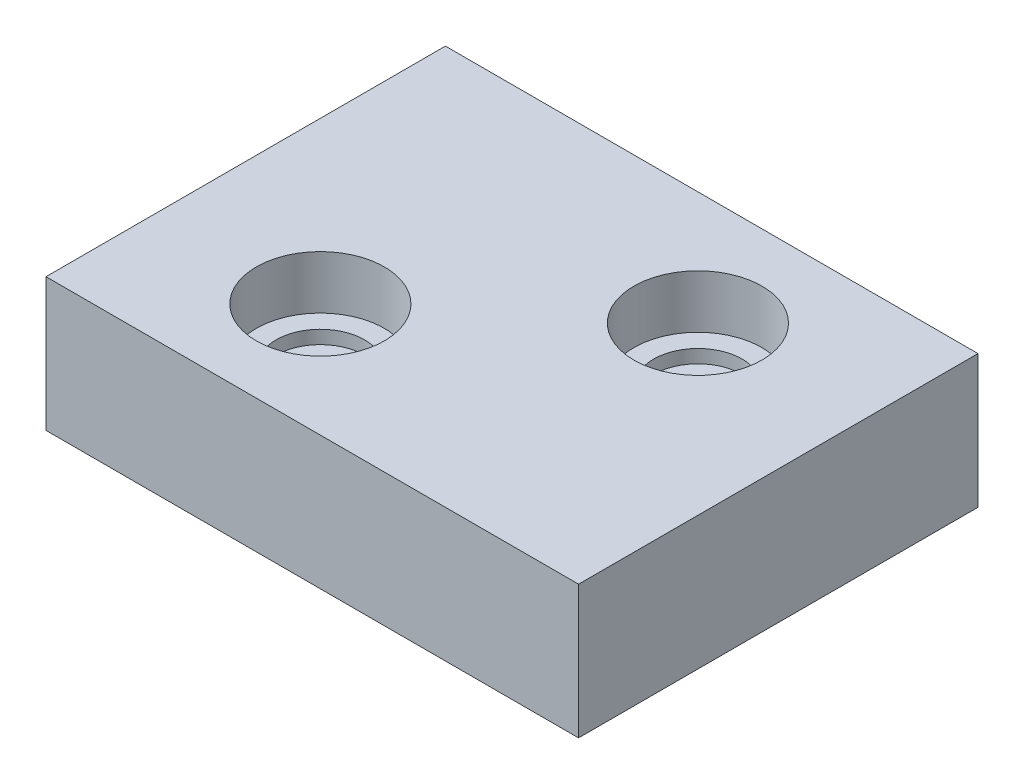
ISO-10303-21;
HEADER;
FILE_DESCRIPTION(('STEP AP214'),'2;1');
FILE_NAME('part.step','',(''),(''),'','','');
FILE_SCHEMA(('AUTOMOTIVE_DESIGN { 1 0 10303 214 1 1 1 1 }'));
ENDSEC;
DATA;
#1=APPLICATION_CONTEXT('core data for automotive mechanical design processes');
#2=APPLICATION_PROTOCOL_DEFINITION('international standard','automotive_design',2000,#1);
#3=PRODUCT_CONTEXT('',#1,'mechanical');
#4=PRODUCT('Part','Part','',(#3));
#5=PRODUCT_RELATED_PRODUCT_CATEGORY('part','',(#4));
#6=PRODUCT_DEFINITION_FORMATION('','',#4);
#7=PRODUCT_DEFINITION_CONTEXT('part definition',#1,'design');
#8=PRODUCT_DEFINITION('design','',#6,#7);
#9=PRODUCT_DEFINITION_SHAPE('','',#8);
#10=(LENGTH_UNIT() NAMED_UNIT(*) SI_UNIT(.MILLI.,.METRE.));
#11=(NAMED_UNIT(*) PLANE_ANGLE_UNIT() SI_UNIT($,.RADIAN.));
#12=(NAMED_UNIT(*) SI_UNIT($,.STERADIAN.) SOLID_ANGLE_UNIT());
#13=UNCERTAINTY_MEASURE_WITH_UNIT(LENGTH_MEASURE(1.E-05),#10,'distance_accuracy_value','');
#14=(GEOMETRIC_REPRESENTATION_CONTEXT(3) GLOBAL_UNCERTAINTY_ASSIGNED_CONTEXT((#13)) GLOBAL_UNIT_ASSIGNED_CONTEXT((#10,
#11,#12)) REPRESENTATION_CONTEXT('',''));
#15=CARTESIAN_POINT('',(0.,0.,0.));
#16=DIRECTION('',(0.,0.,1.));
#17=DIRECTION('',(1.,0.,0.));
#18=AXIS2_PLACEMENT_3D('',#15,#16,#17);
#19=CARTESIAN_POINT('',(20.,10.,15.));
#20=DIRECTION('',(-1.,0.,0.));
#21=DIRECTION('',(0.,0.,1.));
#22=AXIS2_PLACEMENT_3D('',#19,#20,#21);
#23=PLANE('',#22);
#24=DIRECTION('',(0.,0.,-1.));
#25=VECTOR('',#24,1.);
#26=CARTESIAN_POINT('',(20.,0.,15.));
#27=LINE('',#26,#25);
#28=CARTESIAN_POINT('',(20.,0.,15.));
#29=VERTEX_POINT('',#28);
#30=CARTESIAN_POINT('',(20.,0.,-15.));
#31=VERTEX_POINT('',#30);
#32=EDGE_CURVE('E111',#29,#31,#27,.T.);
#33=ORIENTED_EDGE('',*,*,#32,.T.);
#34=DIRECTION('',(0.,-1.,0.));
#35=VECTOR('',#34,1.);
#36=CARTESIAN_POINT('',(20.,10.,-15.));
#37=LINE('',#36,#35);
#38=CARTESIAN_POINT('',(20.,10.,-15.));
#39=VERTEX_POINT('',#38);
#40=EDGE_CURVE('E11',#39,#31,#37,.T.);
#41=ORIENTED_EDGE('',*,*,#40,.F.);
#42=DIRECTION('',(0.,0.,-1.));
#43=VECTOR('',#42,1.);
#44=CARTESIAN_POINT('',(20.,10.,15.));
#45=LINE('',#44,#43);
#46=CARTESIAN_POINT('',(20.,10.,15.));
#47=VERTEX_POINT('',#46);
#48=EDGE_CURVE('E95',#47,#39,#45,.T.);
#49=ORIENTED_EDGE('',*,*,#48,.F.);
#50=DIRECTION('',(0.,-1.,0.));
#51=VECTOR('',#50,1.);
#52=CARTESIAN_POINT('',(20.,10.,15.));
#53=LINE('',#52,#51);
#54=EDGE_CURVE('E107',#47,#29,#53,.T.);
#55=ORIENTED_EDGE('',*,*,#54,.T.);
#56=EDGE_LOOP('',(#33,#41,#49,#55));
#57=FACE_BOUND('',#56,.T.);
#58=ADVANCED_FACE('F43',(#57),#23,.F.);
#59=CARTESIAN_POINT('',(-20.,10.,-15.));
#60=DIRECTION('',(0.,0.,1.));
#61=DIRECTION('',(1.,0.,0.));
#62=AXIS2_PLACEMENT_3D('',#59,#60,#61);
#63=PLANE('',#62);
#64=DIRECTION('',(-1.,0.,0.));
#65=VECTOR('',#64,1.);
#66=CARTESIAN_POINT('',(-20.,0.,-15.));
#67=LINE('',#66,#65);
#68=CARTESIAN_POINT('',(-20.,0.,-15.));
#69=VERTEX_POINT('',#68);
#70=EDGE_CURVE('E100',#31,#69,#67,.T.);
#71=ORIENTED_EDGE('',*,*,#70,.T.);
#72=DIRECTION('',(0.,-1.,0.));
#73=VECTOR('',#72,1.);
#74=CARTESIAN_POINT('',(-20.,10.,-15.));
#75=LINE('',#74,#73);
#76=CARTESIAN_POINT('',(-20.,10.,-15.));
#77=VERTEX_POINT('',#76);
#78=EDGE_CURVE('E52',#77,#69,#75,.T.);
#79=ORIENTED_EDGE('',*,*,#78,.F.);
#80=DIRECTION('',(-1.,0.,0.));
#81=VECTOR('',#80,1.);
#82=CARTESIAN_POINT('',(-20.,10.,-15.));
#83=LINE('',#82,#81);
#84=EDGE_CURVE('E90',#39,#77,#83,.T.);
#85=ORIENTED_EDGE('',*,*,#84,.F.);
#86=ORIENTED_EDGE('',*,*,#40,.T.);
#87=EDGE_LOOP('',(#71,#79,#85,#86));
#88=FACE_BOUND('',#87,.T.);
#89=ADVANCED_FACE('F99',(#88),#63,.F.);
#90=CARTESIAN_POINT('',(-20.,10.,15.));
#91=DIRECTION('',(1.,0.,0.));
#92=DIRECTION('',(0.,0.,-1.));
#93=AXIS2_PLACEMENT_3D('',#90,#91,#92);
#94=PLANE('',#93);
#95=DIRECTION('',(0.,0.,1.));
#96=VECTOR('',#95,1.);
#97=CARTESIAN_POINT('',(-20.,0.,15.));
#98=LINE('',#97,#96);
#99=CARTESIAN_POINT('',(-20.,0.,15.));
#100=VERTEX_POINT('',#99);
#101=EDGE_CURVE('E77',#69,#100,#98,.T.);
#102=ORIENTED_EDGE('',*,*,#101,.T.);
#103=DIRECTION('',(0.,-1.,0.));
#104=VECTOR('',#103,1.);
#105=CARTESIAN_POINT('',(-20.,10.,15.));
#106=LINE('',#105,#104);
#107=CARTESIAN_POINT('',(-20.,10.,15.));
#108=VERTEX_POINT('',#107);
#109=EDGE_CURVE('E102',#108,#100,#106,.T.);
#110=ORIENTED_EDGE('',*,*,#109,.F.);
#111=DIRECTION('',(0.,0.,1.));
#112=VECTOR('',#111,1.);
#113=CARTESIAN_POINT('',(-20.,10.,15.));
#114=LINE('',#113,#112);
#115=EDGE_CURVE('E93',#77,#108,#114,.T.);
#116=ORIENTED_EDGE('',*,*,#115,.F.);
#117=ORIENTED_EDGE('',*,*,#78,.T.);
#118=EDGE_LOOP('',(#102,#110,#116,#117));
#119=FACE_BOUND('',#118,.T.);
#120=ADVANCED_FACE('F103',(#119),#94,.F.);
#121=CARTESIAN_POINT('',(-20.,10.,15.));
#122=DIRECTION('',(0.,0.,-1.));
#123=DIRECTION('',(-1.,0.,0.));
#124=AXIS2_PLACEMENT_3D('',#121,#122,#123);
#125=PLANE('',#124);
#126=DIRECTION('',(1.,0.,0.));
#127=VECTOR('',#126,1.);
#128=CARTESIAN_POINT('',(-20.,0.,15.));
#129=LINE('',#128,#127);
#130=EDGE_CURVE('E83',#100,#29,#129,.T.);
#131=ORIENTED_EDGE('',*,*,#130,.T.);
#132=ORIENTED_EDGE('',*,*,#54,.F.);
#133=DIRECTION('',(1.,0.,0.));
#134=VECTOR('',#133,1.);
#135=CARTESIAN_POINT('',(-20.,10.,15.));
#136=LINE('',#135,#134);
#137=EDGE_CURVE('E60',#108,#47,#136,.T.);
#138=ORIENTED_EDGE('',*,*,#137,.F.);
#139=ORIENTED_EDGE('',*,*,#109,.T.);
#140=EDGE_LOOP('',(#131,#132,#138,#139));
#141=FACE_BOUND('',#140,.T.);
#142=ADVANCED_FACE('F125',(#141),#125,.F.);
#143=CARTESIAN_POINT('',(0.,10.,0.));
#144=DIRECTION('',(0.,-1.,0.));
#145=DIRECTION('',(0.,0.,-1.));
#146=AXIS2_PLACEMENT_3D('',#143,#144,#145);
#147=PLANE('',#146);
#148=CARTESIAN_POINT('',(-7.9286,10.,6.465));
#149=DIRECTION('',(0.,1.,0.));
#150=DIRECTION('',(0.,0.,1.));
#151=AXIS2_PLACEMENT_3D('',#148,#149,#150);
#152=CIRCLE('',#151,4.8125);
#153=CARTESIAN_POINT('',(-7.9286,10.,11.2775));
#154=VERTEX_POINT('',#153);
#155=EDGE_CURVE('E173',#154,#154,#152,.T.);
#156=ORIENTED_EDGE('',*,*,#155,.F.);
#157=EDGE_LOOP('',(#156));
#158=FACE_BOUND('',#157,.T.);
#159=CARTESIAN_POINT('',(7.5,10.,-6.4636));
#160=DIRECTION('',(0.,1.,0.));
#161=DIRECTION('',(0.,0.,1.));
#162=AXIS2_PLACEMENT_3D('',#159,#160,#161);
#163=CIRCLE('',#162,4.8125);
#164=CARTESIAN_POINT('',(7.5,10.,-1.6511));
#165=VERTEX_POINT('',#164);
#166=EDGE_CURVE('E168',#165,#165,#163,.T.);
#167=ORIENTED_EDGE('',*,*,#166,.F.);
#168=EDGE_LOOP('',(#167));
#169=FACE_BOUND('',#168,.T.);
#170=ORIENTED_EDGE('',*,*,#48,.T.);
#171=ORIENTED_EDGE('',*,*,#84,.T.);
#172=ORIENTED_EDGE('',*,*,#115,.T.);
#173=ORIENTED_EDGE('',*,*,#137,.T.);
#174=EDGE_LOOP('',(#170,#171,#172,#173));
#175=FACE_BOUND('',#174,.T.);
#176=ADVANCED_FACE('F91',(#158,#169,#175),#147,.F.);
#177=CARTESIAN_POINT('',(0.,0.,0.));
#178=DIRECTION('',(0.,-1.,0.));
#179=DIRECTION('',(0.,0.,-1.));
#180=AXIS2_PLACEMENT_3D('',#177,#178,#179);
#181=PLANE('',#180);
#182=CARTESIAN_POINT('',(-13.3333333333333,0.,10.));
#183=DIRECTION('',(0.,-1.,0.));
#184=DIRECTION('',(0.,0.,1.));
#185=AXIS2_PLACEMENT_3D('',#182,#183,#184);
#186=CIRCLE('',#185,1.55);
#187=CARTESIAN_POINT('',(-13.3333333333333,0.,11.55));
#188=VERTEX_POINT('',#187);
#189=EDGE_CURVE('E136',#188,#188,#186,.T.);
#190=ORIENTED_EDGE('',*,*,#189,.F.);
#191=EDGE_LOOP('',(#190));
#192=FACE_BOUND('',#191,.T.);
#193=CARTESIAN_POINT('',(13.3333333333333,0.,-10.));
#194=DIRECTION('',(0.,-1.,0.));
#195=DIRECTION('',(0.,0.,1.));
#196=AXIS2_PLACEMENT_3D('',#193,#194,#195);
#197=CIRCLE('',#196,1.55);
#198=CARTESIAN_POINT('',(13.3333333333333,0.,-8.45));
#199=VERTEX_POINT('',#198);
#200=EDGE_CURVE('E144',#199,#199,#197,.T.);
#201=ORIENTED_EDGE('',*,*,#200,.F.);
#202=EDGE_LOOP('',(#201));
#203=FACE_BOUND('',#202,.T.);
#204=CARTESIAN_POINT('',(-13.3333333333333,0.,-9.99999999999999));
#205=DIRECTION('',(0.,-1.,0.));
#206=DIRECTION('',(0.,0.,-1.));
#207=AXIS2_PLACEMENT_3D('',#204,#205,#206);
#208=CIRCLE('',#207,1.55);
#209=CARTESIAN_POINT('',(-13.3333333333333,0.,-11.55));
#210=VERTEX_POINT('',#209);
#211=EDGE_CURVE('E145',#210,#210,#208,.T.);
#212=ORIENTED_EDGE('',*,*,#211,.F.);
#213=EDGE_LOOP('',(#212));
#214=FACE_BOUND('',#213,.T.);
#215=CARTESIAN_POINT('',(13.3333333333333,0.,10.));
#216=DIRECTION('',(0.,-1.,0.));
#217=DIRECTION('',(0.,0.,-1.));
#218=AXIS2_PLACEMENT_3D('',#215,#216,#217);
#219=CIRCLE('',#218,1.55);
#220=CARTESIAN_POINT('',(13.3333333333333,0.,8.45));
#221=VERTEX_POINT('',#220);
#222=EDGE_CURVE('E132',#221,#221,#219,.T.);
#223=ORIENTED_EDGE('',*,*,#222,.F.);
#224=EDGE_LOOP('',(#223));
#225=FACE_BOUND('',#224,.T.);
#226=ORIENTED_EDGE('',*,*,#32,.F.);
#227=ORIENTED_EDGE('',*,*,#130,.F.);
#228=ORIENTED_EDGE('',*,*,#101,.F.);
#229=ORIENTED_EDGE('',*,*,#70,.F.);
#230=EDGE_LOOP('',(#226,#227,#228,#229));
#231=FACE_BOUND('',#230,.T.);
#232=ADVANCED_FACE('F128',(#192,#203,#214,#225,#231),#181,.T.);
#233=CARTESIAN_POINT('',(13.3333333333333,4.,10.));
#234=DIRECTION('',(0.,-1.,0.));
#235=DIRECTION('',(0.,0.,-1.));
#236=AXIS2_PLACEMENT_3D('',#233,#234,#235);
#237=CYLINDRICAL_SURFACE('',#236,1.55);
#238=CARTESIAN_POINT('',(13.3333333333333,4.,10.));
#239=DIRECTION('',(0.,-1.,0.));
#240=DIRECTION('',(0.,0.,-1.));
#241=AXIS2_PLACEMENT_3D('',#238,#239,#240);
#242=CIRCLE('',#241,1.55);
#243=CARTESIAN_POINT('',(13.3333333333333,4.,8.45));
#244=VERTEX_POINT('',#243);
#245=EDGE_CURVE('E115',#244,#244,#242,.T.);
#246=ORIENTED_EDGE('',*,*,#245,.F.);
#247=EDGE_LOOP('',(#246));
#248=FACE_BOUND('',#247,.T.);
#249=ORIENTED_EDGE('',*,*,#222,.T.);
#250=EDGE_LOOP('',(#249));
#251=FACE_BOUND('',#250,.T.);
#252=ADVANCED_FACE('F249',(#248,#251),#237,.F.);
#253=CARTESIAN_POINT('',(13.3333333333333,4.,10.));
#254=DIRECTION('',(0.,-1.,0.));
#255=DIRECTION('',(0.,0.,-1.));
#256=AXIS2_PLACEMENT_3D('',#253,#254,#255);
#257=PLANE('',#256);
#258=ORIENTED_EDGE('',*,*,#245,.T.);
#259=EDGE_LOOP('',(#258));
#260=FACE_BOUND('',#259,.T.);
#261=ADVANCED_FACE('F254',(#260),#257,.T.);
#262=CARTESIAN_POINT('',(-13.3333333333333,4.,-9.99999999999999));
#263=DIRECTION('',(0.,-1.,0.));
#264=DIRECTION('',(0.,0.,-1.));
#265=AXIS2_PLACEMENT_3D('',#262,#263,#264);
#266=CYLINDRICAL_SURFACE('',#265,1.55);
#267=CARTESIAN_POINT('',(-13.3333333333333,4.,-9.99999999999999));
#268=DIRECTION('',(0.,-1.,0.));
#269=DIRECTION('',(0.,0.,-1.));
#270=AXIS2_PLACEMENT_3D('',#267,#268,#269);
#271=CIRCLE('',#270,1.55);
#272=CARTESIAN_POINT('',(-13.3333333333333,4.,-11.55));
#273=VERTEX_POINT('',#272);
#274=EDGE_CURVE('E156',#273,#273,#271,.T.);
#275=ORIENTED_EDGE('',*,*,#274,.F.);
#276=EDGE_LOOP('',(#275));
#277=FACE_BOUND('',#276,.T.);
#278=ORIENTED_EDGE('',*,*,#211,.T.);
#279=EDGE_LOOP('',(#278));
#280=FACE_BOUND('',#279,.T.);
#281=ADVANCED_FACE('F258',(#277,#280),#266,.F.);
#282=CARTESIAN_POINT('',(-13.3333333333333,4.,-9.99999999999999));
#283=DIRECTION('',(0.,-1.,0.));
#284=DIRECTION('',(0.,0.,-1.));
#285=AXIS2_PLACEMENT_3D('',#282,#283,#284);
#286=PLANE('',#285);
#287=ORIENTED_EDGE('',*,*,#274,.T.);
#288=EDGE_LOOP('',(#287));
#289=FACE_BOUND('',#288,.T.);
#290=ADVANCED_FACE('F266',(#289),#286,.T.);
#291=CARTESIAN_POINT('',(13.3333333333333,4.,-10.));
#292=DIRECTION('',(0.,-1.,0.));
#293=DIRECTION('',(0.,0.,-1.));
#294=AXIS2_PLACEMENT_3D('',#291,#292,#293);
#295=CYLINDRICAL_SURFACE('',#294,1.55);
#296=CARTESIAN_POINT('',(13.3333333333333,4.,-10.));
#297=DIRECTION('',(0.,-1.,0.));
#298=DIRECTION('',(0.,0.,1.));
#299=AXIS2_PLACEMENT_3D('',#296,#297,#298);
#300=CIRCLE('',#299,1.55);
#301=CARTESIAN_POINT('',(13.3333333333333,4.,-8.45));
#302=VERTEX_POINT('',#301);
#303=EDGE_CURVE('E140',#302,#302,#300,.T.);
#304=ORIENTED_EDGE('',*,*,#303,.F.);
#305=EDGE_LOOP('',(#304));
#306=FACE_BOUND('',#305,.T.);
#307=ORIENTED_EDGE('',*,*,#200,.T.);
#308=EDGE_LOOP('',(#307));
#309=FACE_BOUND('',#308,.T.);
#310=ADVANCED_FACE('F263',(#306,#309),#295,.F.);
#311=CARTESIAN_POINT('',(13.3333333333333,4.,-10.));
#312=DIRECTION('',(0.,1.,0.));
#313=DIRECTION('',(0.,0.,1.));
#314=AXIS2_PLACEMENT_3D('',#311,#312,#313);
#315=PLANE('',#314);
#316=ORIENTED_EDGE('',*,*,#303,.T.);
#317=EDGE_LOOP('',(#316));
#318=FACE_BOUND('',#317,.T.);
#319=ADVANCED_FACE('F260',(#318),#315,.F.);
#320=CARTESIAN_POINT('',(-13.3333333333333,4.,10.));
#321=DIRECTION('',(0.,-1.,0.));
#322=DIRECTION('',(0.,0.,-1.));
#323=AXIS2_PLACEMENT_3D('',#320,#321,#322);
#324=CYLINDRICAL_SURFACE('',#323,1.55);
#325=CARTESIAN_POINT('',(-13.3333333333333,4.,10.));
#326=DIRECTION('',(0.,-1.,0.));
#327=DIRECTION('',(0.,0.,1.));
#328=AXIS2_PLACEMENT_3D('',#325,#326,#327);
#329=CIRCLE('',#328,1.55);
#330=CARTESIAN_POINT('',(-13.3333333333333,4.,11.55));
#331=VERTEX_POINT('',#330);
#332=EDGE_CURVE('E149',#331,#331,#329,.T.);
#333=ORIENTED_EDGE('',*,*,#332,.F.);
#334=EDGE_LOOP('',(#333));
#335=FACE_BOUND('',#334,.T.);
#336=ORIENTED_EDGE('',*,*,#189,.T.);
#337=EDGE_LOOP('',(#336));
#338=FACE_BOUND('',#337,.T.);
#339=ADVANCED_FACE('F233',(#335,#338),#324,.F.);
#340=CARTESIAN_POINT('',(-13.3333333333333,4.,10.));
#341=DIRECTION('',(0.,1.,0.));
#342=DIRECTION('',(0.,0.,1.));
#343=AXIS2_PLACEMENT_3D('',#340,#341,#342);
#344=PLANE('',#343);
#345=ORIENTED_EDGE('',*,*,#332,.T.);
#346=EDGE_LOOP('',(#345));
#347=FACE_BOUND('',#346,.T.);
#348=ADVANCED_FACE('F224',(#347),#344,.F.);
#349=CARTESIAN_POINT('',(7.5,6.,-6.4636));
#350=DIRECTION('',(0.,1.,0.));
#351=DIRECTION('',(0.,0.,1.));
#352=AXIS2_PLACEMENT_3D('',#349,#350,#351);
#353=CYLINDRICAL_SURFACE('',#352,4.8125);
#354=CARTESIAN_POINT('',(7.5,6.,-6.4636));
#355=DIRECTION('',(0.,1.,0.));
#356=DIRECTION('',(0.,0.,1.));
#357=AXIS2_PLACEMENT_3D('',#354,#355,#356);
#358=CIRCLE('',#357,4.8125);
#359=CARTESIAN_POINT('',(7.5,6.,-1.6511));
#360=VERTEX_POINT('',#359);
#361=EDGE_CURVE('E164',#360,#360,#358,.T.);
#362=ORIENTED_EDGE('',*,*,#361,.F.);
#363=EDGE_LOOP('',(#362));
#364=FACE_BOUND('',#363,.T.);
#365=ORIENTED_EDGE('',*,*,#166,.T.);
#366=EDGE_LOOP('',(#365));
#367=FACE_BOUND('',#366,.T.);
#368=ADVANCED_FACE('F222',(#364,#367),#353,.F.);
#369=CARTESIAN_POINT('',(7.5,6.,-6.4636));
#370=DIRECTION('',(0.,1.,0.));
#371=DIRECTION('',(0.,0.,1.));
#372=AXIS2_PLACEMENT_3D('',#369,#370,#371);
#373=PLANE('',#372);
#374=CARTESIAN_POINT('',(7.5,6.,-6.4636));
#375=DIRECTION('',(0.,1.,0.));
#376=DIRECTION('',(0.,0.,1.));
#377=AXIS2_PLACEMENT_3D('',#374,#375,#376);
#378=CIRCLE('',#377,3.325);
#379=CARTESIAN_POINT('',(7.5,6.,-3.1386));
#380=VERTEX_POINT('',#379);
#381=EDGE_CURVE('E184',#380,#380,#378,.T.);
#382=ORIENTED_EDGE('',*,*,#381,.F.);
#383=EDGE_LOOP('',(#382));
#384=FACE_BOUND('',#383,.T.);
#385=ORIENTED_EDGE('',*,*,#361,.T.);
#386=EDGE_LOOP('',(#385));
#387=FACE_BOUND('',#386,.T.);
#388=ADVANCED_FACE('F213',(#384,#387),#373,.T.);
#389=CARTESIAN_POINT('',(-7.9286,6.,6.465));
#390=DIRECTION('',(0.,1.,0.));
#391=DIRECTION('',(0.,0.,1.));
#392=AXIS2_PLACEMENT_3D('',#389,#390,#391);
#393=CYLINDRICAL_SURFACE('',#392,4.8125);
#394=CARTESIAN_POINT('',(-7.9286,6.,6.465));
#395=DIRECTION('',(0.,1.,0.));
#396=DIRECTION('',(0.,0.,1.));
#397=AXIS2_PLACEMENT_3D('',#394,#395,#396);
#398=CIRCLE('',#397,4.8125);
#399=CARTESIAN_POINT('',(-7.9286,6.,11.2775));
#400=VERTEX_POINT('',#399);
#401=EDGE_CURVE('E160',#400,#400,#398,.T.);
#402=ORIENTED_EDGE('',*,*,#401,.F.);
#403=EDGE_LOOP('',(#402));
#404=FACE_BOUND('',#403,.T.);
#405=ORIENTED_EDGE('',*,*,#155,.T.);
#406=EDGE_LOOP('',(#405));
#407=FACE_BOUND('',#406,.T.);
#408=ADVANCED_FACE('F207',(#404,#407),#393,.F.);
#409=CARTESIAN_POINT('',(-7.9286,6.,6.465));
#410=DIRECTION('',(0.,1.,0.));
#411=DIRECTION('',(0.,0.,1.));
#412=AXIS2_PLACEMENT_3D('',#409,#410,#411);
#413=PLANE('',#412);
#414=CARTESIAN_POINT('',(-7.9286,6.,6.465));
#415=DIRECTION('',(0.,1.,0.));
#416=DIRECTION('',(0.,0.,1.));
#417=AXIS2_PLACEMENT_3D('',#414,#415,#416);
#418=CIRCLE('',#417,3.325);
#419=CARTESIAN_POINT('',(-7.9286,6.,9.79));
#420=VERTEX_POINT('',#419);
#421=EDGE_CURVE('E188',#420,#420,#418,.T.);
#422=ORIENTED_EDGE('',*,*,#421,.F.);
#423=EDGE_LOOP('',(#422));
#424=FACE_BOUND('',#423,.T.);
#425=ORIENTED_EDGE('',*,*,#401,.T.);
#426=EDGE_LOOP('',(#425));
#427=FACE_BOUND('',#426,.T.);
#428=ADVANCED_FACE('F201',(#424,#427),#413,.T.);
#429=CARTESIAN_POINT('',(-7.9286,5.,6.465));
#430=DIRECTION('',(0.,1.,0.));
#431=DIRECTION('',(0.,0.,1.));
#432=AXIS2_PLACEMENT_3D('',#429,#430,#431);
#433=CYLINDRICAL_SURFACE('',#432,3.325);
#434=CARTESIAN_POINT('',(-7.9286,5.,6.465));
#435=DIRECTION('',(0.,1.,0.));
#436=DIRECTION('',(0.,0.,1.));
#437=AXIS2_PLACEMENT_3D('',#434,#435,#436);
#438=CIRCLE('',#437,3.325);
#439=CARTESIAN_POINT('',(-7.9286,5.,9.79));
#440=VERTEX_POINT('',#439);
#441=EDGE_CURVE('E169',#440,#440,#438,.T.);
#442=ORIENTED_EDGE('',*,*,#441,.F.);
#443=EDGE_LOOP('',(#442));
#444=FACE_BOUND('',#443,.T.);
#445=ORIENTED_EDGE('',*,*,#421,.T.);
#446=EDGE_LOOP('',(#445));
#447=FACE_BOUND('',#446,.T.);
#448=ADVANCED_FACE('F198',(#444,#447),#433,.F.);
#449=CARTESIAN_POINT('',(-7.9286,5.,6.465));
#450=DIRECTION('',(0.,1.,0.));
#451=DIRECTION('',(0.,0.,1.));
#452=AXIS2_PLACEMENT_3D('',#449,#450,#451);
#453=PLANE('',#452);
#454=ORIENTED_EDGE('',*,*,#441,.T.);
#455=EDGE_LOOP('',(#454));
#456=FACE_BOUND('',#455,.T.);
#457=ADVANCED_FACE('F196',(#456),#453,.T.);
#458=CARTESIAN_POINT('',(7.5,5.,-6.4636));
#459=DIRECTION('',(0.,1.,0.));
#460=DIRECTION('',(0.,0.,1.));
#461=AXIS2_PLACEMENT_3D('',#458,#459,#460);
#462=CYLINDRICAL_SURFACE('',#461,3.325);
#463=CARTESIAN_POINT('',(7.5,5.,-6.4636));
#464=DIRECTION('',(0.,1.,0.));
#465=DIRECTION('',(0.,0.,1.));
#466=AXIS2_PLACEMENT_3D('',#463,#464,#465);
#467=CIRCLE('',#466,3.325);
#468=CARTESIAN_POINT('',(7.5,5.,-3.1386));
#469=VERTEX_POINT('',#468);
#470=EDGE_CURVE('E180',#469,#469,#467,.T.);
#471=ORIENTED_EDGE('',*,*,#470,.F.);
#472=EDGE_LOOP('',(#471));
#473=FACE_BOUND('',#472,.T.);
#474=ORIENTED_EDGE('',*,*,#381,.T.);
#475=EDGE_LOOP('',(#474));
#476=FACE_BOUND('',#475,.T.);
#477=ADVANCED_FACE('F360',(#473,#476),#462,.F.);
#478=CARTESIAN_POINT('',(7.5,5.,-6.4636));
#479=DIRECTION('',(0.,1.,0.));
#480=DIRECTION('',(0.,0.,1.));
#481=AXIS2_PLACEMENT_3D('',#478,#479,#480);
#482=PLANE('',#481);
#483=ORIENTED_EDGE('',*,*,#470,.T.);
#484=EDGE_LOOP('',(#483));
#485=FACE_BOUND('',#484,.T.);
#486=ADVANCED_FACE('F370',(#485),#482,.T.);
#487=CLOSED_SHELL('',(#58,#89,#120,#142,#176,#232,#252,#261,#281,#290,#310,#319,#339,#348,#368,
#388,#408,#428,#448,#457,#477,#486));
#488=MANIFOLD_SOLID_BREP('B2',#487);
#489=ADVANCED_BREP_SHAPE_REPRESENTATION('',(#18,#488),#14);
#490=SHAPE_DEFINITION_REPRESENTATION(#9,#489);
ENDSEC;
END-ISO-10303-21;
